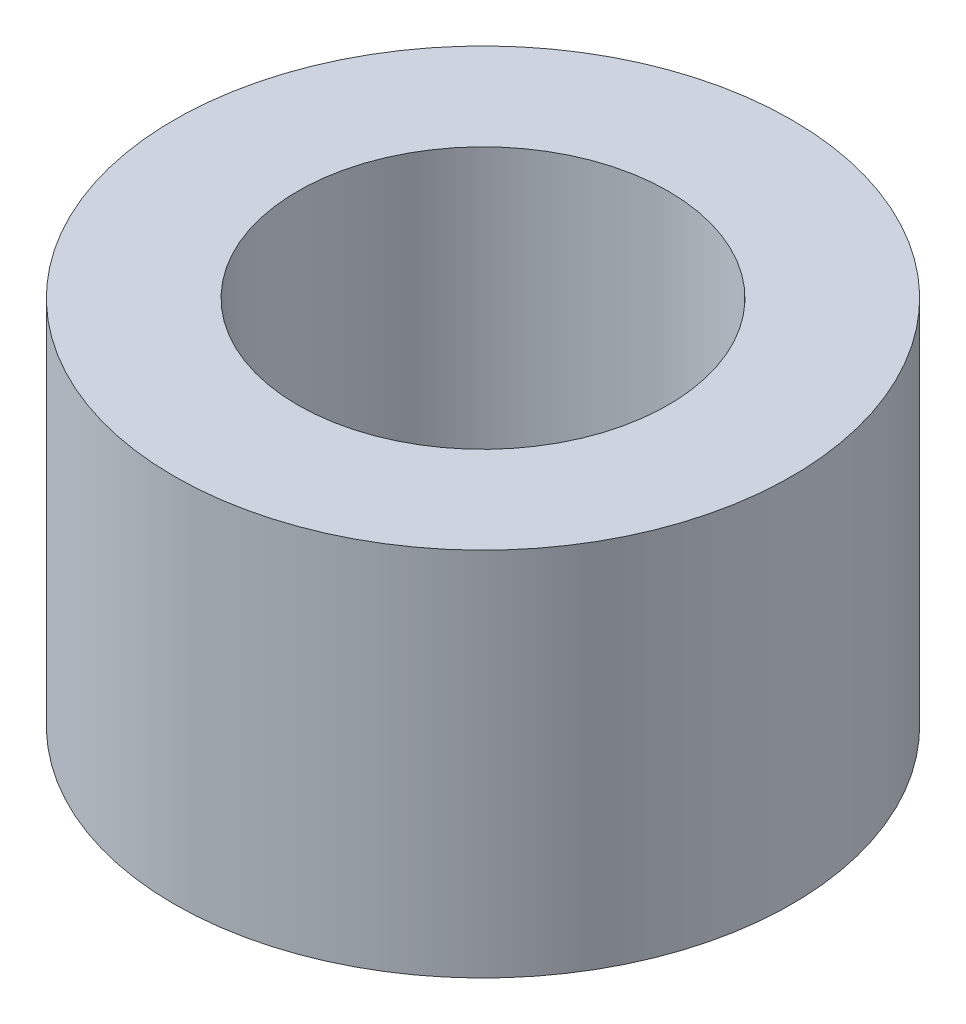
ISO-10303-21;
HEADER;
FILE_DESCRIPTION(('STEP AP214'),'2;1');
FILE_NAME('part.step','',(''),(''),'','','');
FILE_SCHEMA(('AUTOMOTIVE_DESIGN { 1 0 10303 214 1 1 1 1 }'));
ENDSEC;
DATA;
#1=APPLICATION_CONTEXT('core data for automotive mechanical design processes');
#2=APPLICATION_PROTOCOL_DEFINITION('international standard','automotive_design',2000,#1);
#3=PRODUCT_CONTEXT('',#1,'mechanical');
#4=PRODUCT('Part','Part','',(#3));
#5=PRODUCT_RELATED_PRODUCT_CATEGORY('part','',(#4));
#6=PRODUCT_DEFINITION_FORMATION('','',#4);
#7=PRODUCT_DEFINITION_CONTEXT('part definition',#1,'design');
#8=PRODUCT_DEFINITION('design','',#6,#7);
#9=PRODUCT_DEFINITION_SHAPE('','',#8);
#10=(LENGTH_UNIT() NAMED_UNIT(*) SI_UNIT(.MILLI.,.METRE.));
#11=(NAMED_UNIT(*) PLANE_ANGLE_UNIT() SI_UNIT($,.RADIAN.));
#12=(NAMED_UNIT(*) SI_UNIT($,.STERADIAN.) SOLID_ANGLE_UNIT());
#13=UNCERTAINTY_MEASURE_WITH_UNIT(LENGTH_MEASURE(1.E-05),#10,'distance_accuracy_value','');
#14=(GEOMETRIC_REPRESENTATION_CONTEXT(3) GLOBAL_UNCERTAINTY_ASSIGNED_CONTEXT((#13)) GLOBAL_UNIT_ASSIGNED_CONTEXT((#10,
#11,#12)) REPRESENTATION_CONTEXT('',''));
#15=CARTESIAN_POINT('',(0.,0.,0.));
#16=DIRECTION('',(0.,0.,1.));
#17=DIRECTION('',(1.,0.,0.));
#18=AXIS2_PLACEMENT_3D('',#15,#16,#17);
#19=CARTESIAN_POINT('',(0.,15.24,0.));
#20=DIRECTION('',(0.,-1.,0.));
#21=DIRECTION('',(0.,0.,-1.));
#22=AXIS2_PLACEMENT_3D('',#19,#20,#21);
#23=CYLINDRICAL_SURFACE('',#22,3.175);
#24=CARTESIAN_POINT('',(0.,0.,0.));
#25=DIRECTION('',(0.,1.,0.));
#26=DIRECTION('',(0.,0.,1.));
#27=AXIS2_PLACEMENT_3D('',#24,#25,#26);
#28=CIRCLE('',#27,3.175);
#29=CARTESIAN_POINT('',(0.,0.,-3.175));
#30=VERTEX_POINT('',#29);
#31=EDGE_CURVE('E11',#30,#30,#28,.T.);
#32=CARTESIAN_POINT('',(0.,3.81,0.));
#33=DIRECTION('',(0.,1.,0.));
#34=DIRECTION('',(0.,0.,1.));
#35=AXIS2_PLACEMENT_3D('',#32,#33,#34);
#36=CIRCLE('',#35,3.175);
#37=CARTESIAN_POINT('',(0.,3.81,-3.175));
#38=VERTEX_POINT('',#37);
#39=EDGE_CURVE('E56',#38,#38,#36,.T.);
#40=CARTESIAN_POINT('',(0.,0.,-3.175));
#41=CARTESIAN_POINT('',(0.,0.0396874999999998,-3.175));
#42=CARTESIAN_POINT('',(0.,0.0793749999999996,-3.175));
#43=CARTESIAN_POINT('',(0.,0.15875,-3.175));
#44=CARTESIAN_POINT('',(0.,0.1984375,-3.175));
#45=CARTESIAN_POINT('',(0.,0.2778125,-3.175));
#46=CARTESIAN_POINT('',(0.,0.3175,-3.175));
#47=CARTESIAN_POINT('',(0.,0.396875,-3.175));
#48=CARTESIAN_POINT('',(0.,0.436562499999999,-3.175));
#49=CARTESIAN_POINT('',(0.,0.5159375,-3.175));
#50=CARTESIAN_POINT('',(0.,0.555625,-3.175));
#51=CARTESIAN_POINT('',(0.,0.635,-3.175));
#52=CARTESIAN_POINT('',(0.,0.6746875,-3.175));
#53=CARTESIAN_POINT('',(0.,0.7540625,-3.175));
#54=CARTESIAN_POINT('',(0.,0.793749999999999,-3.175));
#55=CARTESIAN_POINT('',(0.,0.873124999999999,-3.175));
#56=CARTESIAN_POINT('',(0.,0.912812499999999,-3.175));
#57=CARTESIAN_POINT('',(0.,0.992187499999999,-3.175));
#58=CARTESIAN_POINT('',(0.,1.031875,-3.175));
#59=CARTESIAN_POINT('',(0.,1.11125,-3.175));
#60=CARTESIAN_POINT('',(0.,1.1509375,-3.175));
#61=CARTESIAN_POINT('',(0.,1.2303125,-3.175));
#62=CARTESIAN_POINT('',(0.,1.27,-3.175));
#63=CARTESIAN_POINT('',(0.,1.349375,-3.175));
#64=CARTESIAN_POINT('',(0.,1.3890625,-3.175));
#65=CARTESIAN_POINT('',(0.,1.4684375,-3.175));
#66=CARTESIAN_POINT('',(0.,1.508125,-3.175));
#67=CARTESIAN_POINT('',(0.,1.5875,-3.175));
#68=CARTESIAN_POINT('',(0.,1.6271875,-3.175));
#69=CARTESIAN_POINT('',(0.,1.7065625,-3.175));
#70=CARTESIAN_POINT('',(0.,1.74625,-3.175));
#71=CARTESIAN_POINT('',(0.,1.825625,-3.175));
#72=CARTESIAN_POINT('',(0.,1.8653125,-3.175));
#73=CARTESIAN_POINT('',(0.,1.9446875,-3.175));
#74=CARTESIAN_POINT('',(0.,1.984375,-3.175));
#75=CARTESIAN_POINT('',(0.,2.06375,-3.175));
#76=CARTESIAN_POINT('',(0.,2.1034375,-3.175));
#77=CARTESIAN_POINT('',(0.,2.1828125,-3.175));
#78=CARTESIAN_POINT('',(0.,2.2225,-3.175));
#79=CARTESIAN_POINT('',(0.,2.301875,-3.175));
#80=CARTESIAN_POINT('',(0.,2.3415625,-3.175));
#81=CARTESIAN_POINT('',(0.,2.4209375,-3.175));
#82=CARTESIAN_POINT('',(0.,2.460625,-3.175));
#83=CARTESIAN_POINT('',(0.,2.54,-3.175));
#84=CARTESIAN_POINT('',(0.,2.5796875,-3.175));
#85=CARTESIAN_POINT('',(0.,2.6590625,-3.175));
#86=CARTESIAN_POINT('',(0.,2.69875,-3.175));
#87=CARTESIAN_POINT('',(0.,2.778125,-3.175));
#88=CARTESIAN_POINT('',(0.,2.8178125,-3.175));
#89=CARTESIAN_POINT('',(0.,2.8971875,-3.175));
#90=CARTESIAN_POINT('',(0.,2.936875,-3.175));
#91=CARTESIAN_POINT('',(0.,3.01625,-3.175));
#92=CARTESIAN_POINT('',(0.,3.0559375,-3.175));
#93=CARTESIAN_POINT('',(0.,3.1353125,-3.175));
#94=CARTESIAN_POINT('',(0.,3.175,-3.175));
#95=CARTESIAN_POINT('',(0.,3.254375,-3.175));
#96=CARTESIAN_POINT('',(0.,3.2940625,-3.175));
#97=CARTESIAN_POINT('',(0.,3.3734375,-3.175));
#98=CARTESIAN_POINT('',(0.,3.413125,-3.175));
#99=CARTESIAN_POINT('',(0.,3.4925,-3.175));
#100=CARTESIAN_POINT('',(0.,3.5321875,-3.175));
#101=CARTESIAN_POINT('',(0.,3.6115625,-3.175));
#102=CARTESIAN_POINT('',(0.,3.65125,-3.175));
#103=CARTESIAN_POINT('',(0.,3.730625,-3.175));
#104=CARTESIAN_POINT('',(0.,3.7703125,-3.175));
#105=CARTESIAN_POINT('',(0.,3.81,-3.175));
#106=B_SPLINE_CURVE_WITH_KNOTS('',3,(#40,#41,#42,#43,#44,#45,#46,#47,#48,#49,#50,#51,#52,#53,
#54,#55,#56,#57,#58,#59,#60,#61,#62,#63,#64,#65,#66,#67,#68,#69,#70,#71,#72,#73,#74,#75,#76,#77,
#78,#79,#80,#81,#82,#83,#84,#85,#86,#87,#88,#89,#90,#91,#92,#93,#94,#95,#96,#97,#98,#99,#100,
#101,#102,#103,#104,#105),.UNSPECIFIED.,.F.,.F.,(4,2,2,2,2,2,2,2,2,2,2,2,2,2,2,2,2,2,2,2,2,2,2,
2,2,2,2,2,2,2,2,2,4),(0.,0.119062499999999,0.238125,0.3571875,0.476249999999999,0.5953125,
0.714375,0.833437499999999,0.952499999999998,1.0715625,1.190625,1.3096875,1.42875,1.5478125,
1.666875,1.7859375,1.905,2.0240625,2.143125,2.2621875,2.38125,2.5003125,2.619375,2.7384375,
2.8575,2.9765625,3.095625,3.2146875,3.33375,3.4528125,3.571875,3.6909375,3.81),.UNSPECIFIED.);
#107=EDGE_CURVE('BSEAM43',#30,#38,#106,.T.);
#108=ORIENTED_EDGE('',*,*,#31,.T.);
#109=ORIENTED_EDGE('',*,*,#39,.F.);
#110=ORIENTED_EDGE('',*,*,#107,.T.);
#111=ORIENTED_EDGE('',*,*,#107,.F.);
#112=EDGE_LOOP('',(#108,#110,#109,#111));
#113=FACE_BOUND('',#112,.T.);
#114=ADVANCED_FACE('F43',(#113),#23,.T.);
#115=CARTESIAN_POINT('',(0.,15.24,0.));
#116=DIRECTION('',(0.,-1.,0.));
#117=DIRECTION('',(0.,0.,-1.));
#118=AXIS2_PLACEMENT_3D('',#115,#116,#117);
#119=CYLINDRICAL_SURFACE('',#118,1.905);
#120=CARTESIAN_POINT('',(0.,0.,0.));
#121=DIRECTION('',(0.,1.,0.));
#122=DIRECTION('',(0.,0.,1.));
#123=AXIS2_PLACEMENT_3D('',#120,#121,#122);
#124=CIRCLE('',#123,1.905);
#125=CARTESIAN_POINT('',(0.,0.,-1.905));
#126=VERTEX_POINT('',#125);
#127=EDGE_CURVE('E51',#126,#126,#124,.T.);
#128=CARTESIAN_POINT('',(0.,3.81,0.));
#129=DIRECTION('',(0.,1.,0.));
#130=DIRECTION('',(0.,0.,1.));
#131=AXIS2_PLACEMENT_3D('',#128,#129,#130);
#132=CIRCLE('',#131,1.905);
#133=CARTESIAN_POINT('',(0.,3.81,-1.905));
#134=VERTEX_POINT('',#133);
#135=EDGE_CURVE('E46',#134,#134,#132,.T.);
#136=CARTESIAN_POINT('',(0.,0.,-1.905));
#137=CARTESIAN_POINT('',(0.,0.0396874999999998,-1.905));
#138=CARTESIAN_POINT('',(0.,0.0793749999999996,-1.905));
#139=CARTESIAN_POINT('',(0.,0.15875,-1.905));
#140=CARTESIAN_POINT('',(0.,0.1984375,-1.905));
#141=CARTESIAN_POINT('',(0.,0.2778125,-1.905));
#142=CARTESIAN_POINT('',(0.,0.3175,-1.905));
#143=CARTESIAN_POINT('',(0.,0.396875,-1.905));
#144=CARTESIAN_POINT('',(0.,0.436562499999999,-1.905));
#145=CARTESIAN_POINT('',(0.,0.5159375,-1.905));
#146=CARTESIAN_POINT('',(0.,0.555625,-1.905));
#147=CARTESIAN_POINT('',(0.,0.635,-1.905));
#148=CARTESIAN_POINT('',(0.,0.6746875,-1.905));
#149=CARTESIAN_POINT('',(0.,0.7540625,-1.905));
#150=CARTESIAN_POINT('',(0.,0.793749999999999,-1.905));
#151=CARTESIAN_POINT('',(0.,0.873124999999999,-1.905));
#152=CARTESIAN_POINT('',(0.,0.912812499999999,-1.905));
#153=CARTESIAN_POINT('',(0.,0.992187499999999,-1.905));
#154=CARTESIAN_POINT('',(0.,1.031875,-1.905));
#155=CARTESIAN_POINT('',(0.,1.11125,-1.905));
#156=CARTESIAN_POINT('',(0.,1.1509375,-1.905));
#157=CARTESIAN_POINT('',(0.,1.2303125,-1.905));
#158=CARTESIAN_POINT('',(0.,1.27,-1.905));
#159=CARTESIAN_POINT('',(0.,1.349375,-1.905));
#160=CARTESIAN_POINT('',(0.,1.3890625,-1.905));
#161=CARTESIAN_POINT('',(0.,1.4684375,-1.905));
#162=CARTESIAN_POINT('',(0.,1.508125,-1.905));
#163=CARTESIAN_POINT('',(0.,1.5875,-1.905));
#164=CARTESIAN_POINT('',(0.,1.6271875,-1.905));
#165=CARTESIAN_POINT('',(0.,1.7065625,-1.905));
#166=CARTESIAN_POINT('',(0.,1.74625,-1.905));
#167=CARTESIAN_POINT('',(0.,1.825625,-1.905));
#168=CARTESIAN_POINT('',(0.,1.8653125,-1.905));
#169=CARTESIAN_POINT('',(0.,1.9446875,-1.905));
#170=CARTESIAN_POINT('',(0.,1.984375,-1.905));
#171=CARTESIAN_POINT('',(0.,2.06375,-1.905));
#172=CARTESIAN_POINT('',(0.,2.1034375,-1.905));
#173=CARTESIAN_POINT('',(0.,2.1828125,-1.905));
#174=CARTESIAN_POINT('',(0.,2.2225,-1.905));
#175=CARTESIAN_POINT('',(0.,2.301875,-1.905));
#176=CARTESIAN_POINT('',(0.,2.3415625,-1.905));
#177=CARTESIAN_POINT('',(0.,2.4209375,-1.905));
#178=CARTESIAN_POINT('',(0.,2.460625,-1.905));
#179=CARTESIAN_POINT('',(0.,2.54,-1.905));
#180=CARTESIAN_POINT('',(0.,2.5796875,-1.905));
#181=CARTESIAN_POINT('',(0.,2.6590625,-1.905));
#182=CARTESIAN_POINT('',(0.,2.69875,-1.905));
#183=CARTESIAN_POINT('',(0.,2.778125,-1.905));
#184=CARTESIAN_POINT('',(0.,2.8178125,-1.905));
#185=CARTESIAN_POINT('',(0.,2.8971875,-1.905));
#186=CARTESIAN_POINT('',(0.,2.936875,-1.905));
#187=CARTESIAN_POINT('',(0.,3.01625,-1.905));
#188=CARTESIAN_POINT('',(0.,3.0559375,-1.905));
#189=CARTESIAN_POINT('',(0.,3.1353125,-1.905));
#190=CARTESIAN_POINT('',(0.,3.175,-1.905));
#191=CARTESIAN_POINT('',(0.,3.254375,-1.905));
#192=CARTESIAN_POINT('',(0.,3.2940625,-1.905));
#193=CARTESIAN_POINT('',(0.,3.3734375,-1.905));
#194=CARTESIAN_POINT('',(0.,3.413125,-1.905));
#195=CARTESIAN_POINT('',(0.,3.4925,-1.905));
#196=CARTESIAN_POINT('',(0.,3.5321875,-1.905));
#197=CARTESIAN_POINT('',(0.,3.6115625,-1.905));
#198=CARTESIAN_POINT('',(0.,3.65125,-1.905));
#199=CARTESIAN_POINT('',(0.,3.730625,-1.905));
#200=CARTESIAN_POINT('',(0.,3.7703125,-1.905));
#201=CARTESIAN_POINT('',(0.,3.81,-1.905));
#202=B_SPLINE_CURVE_WITH_KNOTS('',3,(#136,#137,#138,#139,#140,#141,#142,#143,#144,#145,#146,
#147,#148,#149,#150,#151,#152,#153,#154,#155,#156,#157,#158,#159,#160,#161,#162,#163,#164,#165,
#166,#167,#168,#169,#170,#171,#172,#173,#174,#175,#176,#177,#178,#179,#180,#181,#182,#183,#184,
#185,#186,#187,#188,#189,#190,#191,#192,#193,#194,#195,#196,#197,#198,#199,#200,#201),
.UNSPECIFIED.,.F.,.F.,(4,2,2,2,2,2,2,2,2,2,2,2,2,2,2,2,2,2,2,2,2,2,2,2,2,2,2,2,2,2,2,2,4),(0.,
0.119062499999999,0.238125,0.3571875,0.476249999999999,0.5953125,0.714375,0.833437499999999,
0.952499999999998,1.0715625,1.190625,1.3096875,1.42875,1.5478125,1.666875,1.7859375,1.905,
2.0240625,2.143125,2.2621875,2.38125,2.5003125,2.619375,2.7384375,2.8575,2.9765625,3.095625,
3.2146875,3.33375,3.4528125,3.571875,3.6909375,3.81),.UNSPECIFIED.);
#203=EDGE_CURVE('BSEAM67',#126,#134,#202,.T.);
#204=ORIENTED_EDGE('',*,*,#127,.F.);
#205=ORIENTED_EDGE('',*,*,#135,.T.);
#206=ORIENTED_EDGE('',*,*,#203,.T.);
#207=ORIENTED_EDGE('',*,*,#203,.F.);
#208=EDGE_LOOP('',(#204,#206,#205,#207));
#209=FACE_BOUND('',#208,.T.);
#210=ADVANCED_FACE('F67',(#209),#119,.F.);
#211=CARTESIAN_POINT('',(0.,0.,0.));
#212=DIRECTION('',(0.,1.,0.));
#213=DIRECTION('',(0.,0.,1.));
#214=AXIS2_PLACEMENT_3D('',#211,#212,#213);
#215=PLANE('',#214);
#216=ORIENTED_EDGE('',*,*,#31,.F.);
#217=EDGE_LOOP('',(#216));
#218=FACE_BOUND('',#217,.T.);
#219=ORIENTED_EDGE('',*,*,#127,.T.);
#220=EDGE_LOOP('',(#219));
#221=FACE_BOUND('',#220,.T.);
#222=ADVANCED_FACE('F71',(#218,#221),#215,.F.);
#223=CARTESIAN_POINT('',(0.,3.81,0.));
#224=DIRECTION('',(0.,1.,0.));
#225=DIRECTION('',(0.,0.,1.));
#226=AXIS2_PLACEMENT_3D('',#223,#224,#225);
#227=PLANE('',#226);
#228=ORIENTED_EDGE('',*,*,#135,.F.);
#229=EDGE_LOOP('',(#228));
#230=FACE_BOUND('',#229,.T.);
#231=ORIENTED_EDGE('',*,*,#39,.T.);
#232=EDGE_LOOP('',(#231));
#233=FACE_BOUND('',#232,.T.);
#234=ADVANCED_FACE('F69',(#230,#233),#227,.T.);
#235=CLOSED_SHELL('',(#114,#210,#222,#234));
#236=MANIFOLD_SOLID_BREP('B2',#235);
#237=ADVANCED_BREP_SHAPE_REPRESENTATION('',(#18,#236),#14);
#238=SHAPE_DEFINITION_REPRESENTATION(#9,#237);
ENDSEC;
END-ISO-10303-21;
